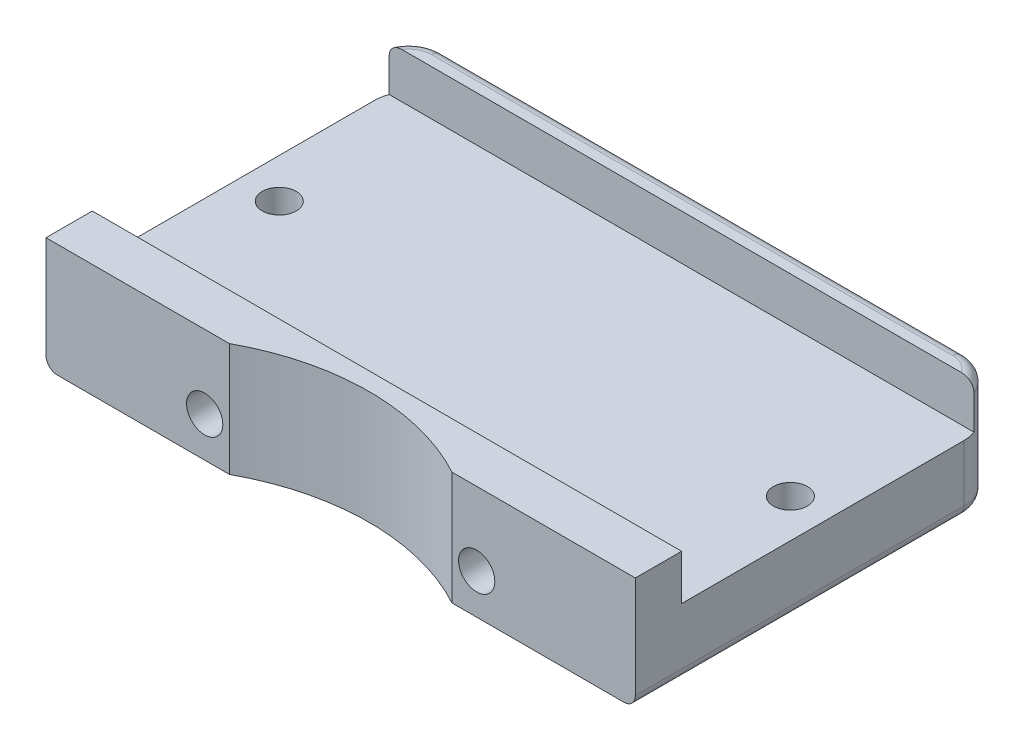
ISO-10303-21;
HEADER;
FILE_DESCRIPTION(('STEP AP214'),'2;1');
FILE_NAME('part.step','',(''),(''),'','','');
FILE_SCHEMA(('AUTOMOTIVE_DESIGN { 1 0 10303 214 1 1 1 1 }'));
ENDSEC;
DATA;
#1=APPLICATION_CONTEXT('core data for automotive mechanical design processes');
#2=APPLICATION_PROTOCOL_DEFINITION('international standard','automotive_design',2000,#1);
#3=PRODUCT_CONTEXT('',#1,'mechanical');
#4=PRODUCT('Part','Part','',(#3));
#5=PRODUCT_RELATED_PRODUCT_CATEGORY('part','',(#4));
#6=PRODUCT_DEFINITION_FORMATION('','',#4);
#7=PRODUCT_DEFINITION_CONTEXT('part definition',#1,'design');
#8=PRODUCT_DEFINITION('design','',#6,#7);
#9=PRODUCT_DEFINITION_SHAPE('','',#8);
#10=(LENGTH_UNIT() NAMED_UNIT(*) SI_UNIT(.MILLI.,.METRE.));
#11=(NAMED_UNIT(*) PLANE_ANGLE_UNIT() SI_UNIT($,.RADIAN.));
#12=(NAMED_UNIT(*) SI_UNIT($,.STERADIAN.) SOLID_ANGLE_UNIT());
#13=UNCERTAINTY_MEASURE_WITH_UNIT(LENGTH_MEASURE(1.E-05),#10,'distance_accuracy_value','');
#14=(GEOMETRIC_REPRESENTATION_CONTEXT(3) GLOBAL_UNCERTAINTY_ASSIGNED_CONTEXT((#13)) GLOBAL_UNIT_ASSIGNED_CONTEXT((#10,
#11,#12)) REPRESENTATION_CONTEXT('',''));
#15=CARTESIAN_POINT('',(0.,0.,0.));
#16=DIRECTION('',(0.,0.,1.));
#17=DIRECTION('',(1.,0.,0.));
#18=AXIS2_PLACEMENT_3D('',#15,#16,#17);
#19=CARTESIAN_POINT('',(0.,10.,33.9949326200461));
#20=DIRECTION('',(0.,1.,0.));
#21=DIRECTION('',(0.,0.,1.));
#22=AXIS2_PLACEMENT_3D('',#19,#20,#21);
#23=PLANE('',#22);
#24=DIRECTION('',(1.,0.,0.));
#25=VECTOR('',#24,1.);
#26=CARTESIAN_POINT('',(26.,10.,11.917981323224));
#27=LINE('',#26,#25);
#28=CARTESIAN_POINT('',(-26.,10.,11.917981323224));
#29=VERTEX_POINT('',#28);
#30=CARTESIAN_POINT('',(26.,10.,11.917981323224));
#31=VERTEX_POINT('',#30);
#32=EDGE_CURVE('E144',#29,#31,#27,.T.);
#33=ORIENTED_EDGE('',*,*,#32,.F.);
#34=DIRECTION('',(0.,0.,1.));
#35=VECTOR('',#34,1.);
#36=CARTESIAN_POINT('',(-26.,10.,16.));
#37=LINE('',#36,#35);
#38=CARTESIAN_POINT('',(-26.,10.,16.));
#39=VERTEX_POINT('',#38);
#40=EDGE_CURVE('E203',#29,#39,#37,.T.);
#41=ORIENTED_EDGE('',*,*,#40,.T.);
#42=DIRECTION('',(1.,0.,0.));
#43=VECTOR('',#42,1.);
#44=CARTESIAN_POINT('',(-26.,10.,16.));
#45=LINE('',#44,#43);
#46=CARTESIAN_POINT('',(-9.82,10.,16.));
#47=VERTEX_POINT('',#46);
#48=EDGE_CURVE('E206',#39,#47,#45,.T.);
#49=ORIENTED_EDGE('',*,*,#48,.T.);
#50=CARTESIAN_POINT('',(0.,10.,33.9949326200461));
#51=DIRECTION('',(0.,-1.,0.));
#52=DIRECTION('',(0.,0.,1.));
#53=AXIS2_PLACEMENT_3D('',#50,#51,#52);
#54=CIRCLE('',#53,20.5);
#55=CARTESIAN_POINT('',(9.82,10.,16.));
#56=VERTEX_POINT('',#55);
#57=EDGE_CURVE('E210',#47,#56,#54,.T.);
#58=ORIENTED_EDGE('',*,*,#57,.T.);
#59=DIRECTION('',(1.,0.,0.));
#60=VECTOR('',#59,1.);
#61=CARTESIAN_POINT('',(9.82,10.,16.));
#62=LINE('',#61,#60);
#63=CARTESIAN_POINT('',(26.,10.,16.));
#64=VERTEX_POINT('',#63);
#65=EDGE_CURVE('E213',#56,#64,#62,.T.);
#66=ORIENTED_EDGE('',*,*,#65,.T.);
#67=DIRECTION('',(0.,0.,-1.));
#68=VECTOR('',#67,1.);
#69=CARTESIAN_POINT('',(26.,10.,16.));
#70=LINE('',#69,#68);
#71=EDGE_CURVE('E216',#64,#31,#70,.T.);
#72=ORIENTED_EDGE('',*,*,#71,.T.);
#73=EDGE_LOOP('',(#33,#41,#49,#58,#66,#72));
#74=FACE_BOUND('',#73,.T.);
#75=ADVANCED_FACE('F16',(#74),#23,.T.);
#76=CARTESIAN_POINT('',(-26.,10.,16.));
#77=DIRECTION('',(1.,0.,0.));
#78=DIRECTION('',(0.,0.,-1.));
#79=AXIS2_PLACEMENT_3D('',#76,#77,#78);
#80=PLANE('',#79);
#81=DIRECTION('',(0.,-1.,0.));
#82=VECTOR('',#81,1.);
#83=CARTESIAN_POINT('',(-26.,10.,-13.));
#84=LINE('',#83,#82);
#85=CARTESIAN_POINT('',(-26.,6.,-13.));
#86=VERTEX_POINT('',#85);
#87=CARTESIAN_POINT('',(-26.,1.,-13.));
#88=VERTEX_POINT('',#87);
#89=EDGE_CURVE('E264',#86,#88,#84,.T.);
#90=ORIENTED_EDGE('',*,*,#89,.T.);
#91=DIRECTION('',(0.,0.,1.));
#92=VECTOR('',#91,1.);
#93=CARTESIAN_POINT('',(-26.,1.,16.));
#94=LINE('',#93,#92);
#95=CARTESIAN_POINT('',(-26.,1.,16.));
#96=VERTEX_POINT('',#95);
#97=EDGE_CURVE('E26',#88,#96,#94,.T.);
#98=ORIENTED_EDGE('',*,*,#97,.T.);
#99=DIRECTION('',(0.,-1.,0.));
#100=VECTOR('',#99,1.);
#101=CARTESIAN_POINT('',(-26.,10.,16.));
#102=LINE('',#101,#100);
#103=EDGE_CURVE('E238',#39,#96,#102,.T.);
#104=ORIENTED_EDGE('',*,*,#103,.F.);
#105=ORIENTED_EDGE('',*,*,#40,.F.);
#106=DIRECTION('',(0.,1.,0.));
#107=VECTOR('',#106,1.);
#108=CARTESIAN_POINT('',(-26.,6.,11.917981323224));
#109=LINE('',#108,#107);
#110=CARTESIAN_POINT('',(-26.,6.,11.917981323224));
#111=VERTEX_POINT('',#110);
#112=EDGE_CURVE('E150',#111,#29,#109,.T.);
#113=ORIENTED_EDGE('',*,*,#112,.F.);
#114=DIRECTION('',(0.,0.,1.));
#115=VECTOR('',#114,1.);
#116=CARTESIAN_POINT('',(-26.,6.,11.917981323224));
#117=LINE('',#116,#115);
#118=EDGE_CURVE('E151',#86,#111,#117,.T.);
#119=ORIENTED_EDGE('',*,*,#118,.F.);
#120=EDGE_LOOP('',(#90,#98,#104,#105,#113,#119));
#121=FACE_BOUND('',#120,.T.);
#122=ADVANCED_FACE('F346',(#121),#80,.F.);
#123=CARTESIAN_POINT('',(-26.,10.,16.));
#124=DIRECTION('',(0.,0.,-1.));
#125=DIRECTION('',(-1.,0.,0.));
#126=AXIS2_PLACEMENT_3D('',#123,#124,#125);
#127=PLANE('',#126);
#128=CARTESIAN_POINT('',(-12.,3.53,16.));
#129=DIRECTION('',(0.,0.,1.));
#130=DIRECTION('',(1.,0.,0.));
#131=AXIS2_PLACEMENT_3D('',#128,#129,#130);
#132=CIRCLE('',#131,1.6);
#133=CARTESIAN_POINT('',(-10.4,3.53,16.));
#134=VERTEX_POINT('',#133);
#135=EDGE_CURVE('E192',#134,#134,#132,.T.);
#136=ORIENTED_EDGE('',*,*,#135,.F.);
#137=EDGE_LOOP('',(#136));
#138=FACE_BOUND('',#137,.T.);
#139=ORIENTED_EDGE('',*,*,#103,.T.);
#140=CARTESIAN_POINT('',(-25.,1.,16.));
#141=DIRECTION('',(0.,0.,-1.));
#142=DIRECTION('',(-1.,0.,0.));
#143=AXIS2_PLACEMENT_3D('',#140,#141,#142);
#144=CIRCLE('',#143,1.);
#145=CARTESIAN_POINT('',(-25.,0.,16.));
#146=VERTEX_POINT('',#145);
#147=EDGE_CURVE('E10',#96,#146,#144,.F.);
#148=ORIENTED_EDGE('',*,*,#147,.T.);
#149=DIRECTION('',(1.,0.,0.));
#150=VECTOR('',#149,1.);
#151=CARTESIAN_POINT('',(-26.,0.,16.));
#152=LINE('',#151,#150);
#153=CARTESIAN_POINT('',(-9.82,0.,16.));
#154=VERTEX_POINT('',#153);
#155=EDGE_CURVE('E191',#146,#154,#152,.T.);
#156=ORIENTED_EDGE('',*,*,#155,.T.);
#157=DIRECTION('',(0.,-1.,0.));
#158=VECTOR('',#157,1.);
#159=CARTESIAN_POINT('',(-9.82,10.,16.));
#160=LINE('',#159,#158);
#161=EDGE_CURVE('E234',#47,#154,#160,.T.);
#162=ORIENTED_EDGE('',*,*,#161,.F.);
#163=ORIENTED_EDGE('',*,*,#48,.F.);
#164=EDGE_LOOP('',(#139,#148,#156,#162,#163));
#165=FACE_BOUND('',#164,.T.);
#166=ADVANCED_FACE('F342',(#138,#165),#127,.F.);
#167=CARTESIAN_POINT('',(0.,10.,33.9949326200461));
#168=DIRECTION('',(0.,-1.,0.));
#169=DIRECTION('',(0.,0.,-1.));
#170=AXIS2_PLACEMENT_3D('',#167,#168,#169);
#171=CYLINDRICAL_SURFACE('',#170,20.5);
#172=CARTESIAN_POINT('',(0.,0.,33.9949326200461));
#173=DIRECTION('',(0.,-1.,0.));
#174=DIRECTION('',(0.,0.,1.));
#175=AXIS2_PLACEMENT_3D('',#172,#173,#174);
#176=CIRCLE('',#175,20.5);
#177=CARTESIAN_POINT('',(9.82,0.,16.));
#178=VERTEX_POINT('',#177);
#179=EDGE_CURVE('E222',#154,#178,#176,.T.);
#180=ORIENTED_EDGE('',*,*,#179,.T.);
#181=DIRECTION('',(0.,-1.,0.));
#182=VECTOR('',#181,1.);
#183=CARTESIAN_POINT('',(9.82,10.,16.));
#184=LINE('',#183,#182);
#185=EDGE_CURVE('E230',#56,#178,#184,.T.);
#186=ORIENTED_EDGE('',*,*,#185,.F.);
#187=ORIENTED_EDGE('',*,*,#57,.F.);
#188=ORIENTED_EDGE('',*,*,#161,.T.);
#189=EDGE_LOOP('',(#180,#186,#187,#188));
#190=FACE_BOUND('',#189,.T.);
#191=ADVANCED_FACE('F338',(#190),#171,.F.);
#192=CARTESIAN_POINT('',(9.82,10.,16.));
#193=DIRECTION('',(0.,0.,-1.));
#194=DIRECTION('',(-1.,0.,0.));
#195=AXIS2_PLACEMENT_3D('',#192,#193,#194);
#196=PLANE('',#195);
#197=CARTESIAN_POINT('',(12.,3.53,16.));
#198=DIRECTION('',(0.,0.,1.));
#199=DIRECTION('',(1.,0.,0.));
#200=AXIS2_PLACEMENT_3D('',#197,#198,#199);
#201=CIRCLE('',#200,1.6);
#202=CARTESIAN_POINT('',(13.6,3.53,16.));
#203=VERTEX_POINT('',#202);
#204=EDGE_CURVE('E196',#203,#203,#201,.T.);
#205=ORIENTED_EDGE('',*,*,#204,.F.);
#206=EDGE_LOOP('',(#205));
#207=FACE_BOUND('',#206,.T.);
#208=DIRECTION('',(1.,0.,0.));
#209=VECTOR('',#208,1.);
#210=CARTESIAN_POINT('',(9.82,0.,16.));
#211=LINE('',#210,#209);
#212=CARTESIAN_POINT('',(25.,0.,16.));
#213=VERTEX_POINT('',#212);
#214=EDGE_CURVE('E207',#178,#213,#211,.T.);
#215=ORIENTED_EDGE('',*,*,#214,.T.);
#216=CARTESIAN_POINT('',(25.,1.,16.));
#217=DIRECTION('',(0.,0.,-1.));
#218=DIRECTION('',(-1.,0.,0.));
#219=AXIS2_PLACEMENT_3D('',#216,#217,#218);
#220=CIRCLE('',#219,1.);
#221=CARTESIAN_POINT('',(26.,1.,16.));
#222=VERTEX_POINT('',#221);
#223=EDGE_CURVE('E408',#213,#222,#220,.F.);
#224=ORIENTED_EDGE('',*,*,#223,.T.);
#225=DIRECTION('',(0.,-1.,0.));
#226=VECTOR('',#225,1.);
#227=CARTESIAN_POINT('',(26.,10.,16.));
#228=LINE('',#227,#226);
#229=EDGE_CURVE('E219',#64,#222,#228,.T.);
#230=ORIENTED_EDGE('',*,*,#229,.F.);
#231=ORIENTED_EDGE('',*,*,#65,.F.);
#232=ORIENTED_EDGE('',*,*,#185,.T.);
#233=EDGE_LOOP('',(#215,#224,#230,#231,#232));
#234=FACE_BOUND('',#233,.T.);
#235=ADVANCED_FACE('F335',(#207,#234),#196,.F.);
#236=CARTESIAN_POINT('',(26.,10.,16.));
#237=DIRECTION('',(-1.,0.,0.));
#238=DIRECTION('',(0.,0.,1.));
#239=AXIS2_PLACEMENT_3D('',#236,#237,#238);
#240=PLANE('',#239);
#241=ORIENTED_EDGE('',*,*,#229,.T.);
#242=DIRECTION('',(0.,0.,-1.));
#243=VECTOR('',#242,1.);
#244=CARTESIAN_POINT('',(26.,1.,16.));
#245=LINE('',#244,#243);
#246=CARTESIAN_POINT('',(26.,1.,-13.));
#247=VERTEX_POINT('',#246);
#248=EDGE_CURVE('E391',#222,#247,#245,.T.);
#249=ORIENTED_EDGE('',*,*,#248,.T.);
#250=DIRECTION('',(0.,-1.,0.));
#251=VECTOR('',#250,1.);
#252=CARTESIAN_POINT('',(26.,10.,-13.));
#253=LINE('',#252,#251);
#254=CARTESIAN_POINT('',(26.,6.,-13.));
#255=VERTEX_POINT('',#254);
#256=EDGE_CURVE('E166',#247,#255,#253,.F.);
#257=ORIENTED_EDGE('',*,*,#256,.T.);
#258=DIRECTION('',(0.,0.,-1.));
#259=VECTOR('',#258,1.);
#260=CARTESIAN_POINT('',(26.,6.,-14.082018676776));
#261=LINE('',#260,#259);
#262=CARTESIAN_POINT('',(26.,6.,11.917981323224));
#263=VERTEX_POINT('',#262);
#264=EDGE_CURVE('E156',#263,#255,#261,.T.);
#265=ORIENTED_EDGE('',*,*,#264,.F.);
#266=DIRECTION('',(0.,1.,0.));
#267=VECTOR('',#266,1.);
#268=CARTESIAN_POINT('',(26.,6.,11.917981323224));
#269=LINE('',#268,#267);
#270=EDGE_CURVE('E138',#263,#31,#269,.T.);
#271=ORIENTED_EDGE('',*,*,#270,.T.);
#272=ORIENTED_EDGE('',*,*,#71,.F.);
#273=EDGE_LOOP('',(#241,#249,#257,#265,#271,#272));
#274=FACE_BOUND('',#273,.T.);
#275=ADVANCED_FACE('F163',(#274),#240,.F.);
#276=CARTESIAN_POINT('',(26.,10.,-16.));
#277=DIRECTION('',(0.,0.,1.));
#278=DIRECTION('',(1.,0.,0.));
#279=AXIS2_PLACEMENT_3D('',#276,#277,#278);
#280=PLANE('',#279);
#281=CARTESIAN_POINT('',(-12.,3.53,-16.));
#282=DIRECTION('',(0.,0.,1.));
#283=DIRECTION('',(1.,0.,0.));
#284=AXIS2_PLACEMENT_3D('',#281,#282,#283);
#285=CIRCLE('',#284,1.6);
#286=CARTESIAN_POINT('',(-10.4,3.53,-16.));
#287=VERTEX_POINT('',#286);
#288=EDGE_CURVE('E187',#287,#287,#285,.T.);
#289=ORIENTED_EDGE('',*,*,#288,.T.);
#290=EDGE_LOOP('',(#289));
#291=FACE_BOUND('',#290,.T.);
#292=CARTESIAN_POINT('',(12.,3.53,-16.));
#293=DIRECTION('',(0.,0.,1.));
#294=DIRECTION('',(1.,0.,0.));
#295=AXIS2_PLACEMENT_3D('',#292,#293,#294);
#296=CIRCLE('',#295,1.6);
#297=CARTESIAN_POINT('',(13.6,3.53,-16.));
#298=VERTEX_POINT('',#297);
#299=EDGE_CURVE('E185',#298,#298,#296,.T.);
#300=ORIENTED_EDGE('',*,*,#299,.T.);
#301=EDGE_LOOP('',(#300));
#302=FACE_BOUND('',#301,.T.);
#303=DIRECTION('',(0.,-1.,0.));
#304=VECTOR('',#303,1.);
#305=CARTESIAN_POINT('',(23.,10.,-16.));
#306=LINE('',#305,#304);
#307=CARTESIAN_POINT('',(23.,9.,-16.));
#308=VERTEX_POINT('',#307);
#309=CARTESIAN_POINT('',(23.,1.,-16.));
#310=VERTEX_POINT('',#309);
#311=EDGE_CURVE('E245',#308,#310,#306,.T.);
#312=ORIENTED_EDGE('',*,*,#311,.T.);
#313=DIRECTION('',(-1.,0.,0.));
#314=VECTOR('',#313,1.);
#315=CARTESIAN_POINT('',(26.,1.,-16.));
#316=LINE('',#315,#314);
#317=CARTESIAN_POINT('',(-23.,1.,-16.));
#318=VERTEX_POINT('',#317);
#319=EDGE_CURVE('E414',#310,#318,#316,.T.);
#320=ORIENTED_EDGE('',*,*,#319,.T.);
#321=DIRECTION('',(0.,-1.,0.));
#322=VECTOR('',#321,1.);
#323=CARTESIAN_POINT('',(-23.,10.,-16.));
#324=LINE('',#323,#322);
#325=CARTESIAN_POINT('',(-23.,9.,-16.));
#326=VERTEX_POINT('',#325);
#327=EDGE_CURVE('E241',#318,#326,#324,.F.);
#328=ORIENTED_EDGE('',*,*,#327,.T.);
#329=DIRECTION('',(-1.,0.,0.));
#330=VECTOR('',#329,1.);
#331=CARTESIAN_POINT('',(23.,9.,-16.));
#332=LINE('',#331,#330);
#333=EDGE_CURVE('E411',#326,#308,#332,.F.);
#334=ORIENTED_EDGE('',*,*,#333,.T.);
#335=EDGE_LOOP('',(#312,#320,#328,#334));
#336=FACE_BOUND('',#335,.T.);
#337=ADVANCED_FACE('F325',(#291,#302,#336),#280,.F.);
#338=DIRECTION('',(-1.,0.,0.));
#339=VECTOR('',#338,1.);
#340=CARTESIAN_POINT('',(-26.,10.,-14.082018676776));
#341=LINE('',#340,#339);
#342=CARTESIAN_POINT('',(24.6820331694435,10.,-14.082018676776));
#343=VERTEX_POINT('',#342);
#344=CARTESIAN_POINT('',(-24.6820331694435,10.,-14.082018676776));
#345=VERTEX_POINT('',#344);
#346=EDGE_CURVE('E160',#343,#345,#341,.T.);
#347=ORIENTED_EDGE('',*,*,#346,.F.);
#348=CARTESIAN_POINT('',(23.,10.,-13.));
#349=DIRECTION('',(0.,1.,0.));
#350=DIRECTION('',(0.,0.,1.));
#351=AXIS2_PLACEMENT_3D('',#348,#349,#350);
#352=CIRCLE('',#351,2.);
#353=CARTESIAN_POINT('',(23.,10.,-15.));
#354=VERTEX_POINT('',#353);
#355=EDGE_CURVE('E273',#343,#354,#352,.T.);
#356=ORIENTED_EDGE('',*,*,#355,.T.);
#357=DIRECTION('',(-1.,0.,0.));
#358=VECTOR('',#357,1.);
#359=CARTESIAN_POINT('',(-23.,10.,-15.));
#360=LINE('',#359,#358);
#361=CARTESIAN_POINT('',(-23.,10.,-15.));
#362=VERTEX_POINT('',#361);
#363=EDGE_CURVE('E267',#354,#362,#360,.T.);
#364=ORIENTED_EDGE('',*,*,#363,.T.);
#365=CARTESIAN_POINT('',(-23.,10.,-13.));
#366=DIRECTION('',(0.,1.,0.));
#367=DIRECTION('',(0.,0.,1.));
#368=AXIS2_PLACEMENT_3D('',#365,#366,#367);
#369=CIRCLE('',#368,2.);
#370=EDGE_CURVE('E270',#362,#345,#369,.T.);
#371=ORIENTED_EDGE('',*,*,#370,.T.);
#372=EDGE_LOOP('',(#347,#356,#364,#371));
#373=FACE_BOUND('',#372,.T.);
#374=ADVANCED_FACE('F322',(#373),#23,.T.);
#375=CARTESIAN_POINT('',(0.,0.,33.9949326200461));
#376=DIRECTION('',(0.,1.,0.));
#377=DIRECTION('',(0.,0.,1.));
#378=AXIS2_PLACEMENT_3D('',#375,#376,#377);
#379=PLANE('',#378);
#380=CARTESIAN_POINT('',(-22.5,0.,-1.08201867677598));
#381=DIRECTION('',(0.,1.,0.));
#382=DIRECTION('',(0.,0.,1.));
#383=AXIS2_PLACEMENT_3D('',#380,#381,#382);
#384=CIRCLE('',#383,1.5);
#385=CARTESIAN_POINT('',(-22.5,0.,0.417981323224016));
#386=VERTEX_POINT('',#385);
#387=EDGE_CURVE('E180',#386,#386,#384,.T.);
#388=ORIENTED_EDGE('',*,*,#387,.T.);
#389=EDGE_LOOP('',(#388));
#390=FACE_BOUND('',#389,.T.);
#391=CARTESIAN_POINT('',(22.6,0.,-1.08201867677598));
#392=DIRECTION('',(0.,1.,0.));
#393=DIRECTION('',(0.,0.,1.));
#394=AXIS2_PLACEMENT_3D('',#391,#392,#393);
#395=CIRCLE('',#394,1.5);
#396=CARTESIAN_POINT('',(22.6,0.,0.417981323224022));
#397=VERTEX_POINT('',#396);
#398=EDGE_CURVE('E425',#397,#397,#395,.T.);
#399=ORIENTED_EDGE('',*,*,#398,.T.);
#400=EDGE_LOOP('',(#399));
#401=FACE_BOUND('',#400,.T.);
#402=CARTESIAN_POINT('',(23.,0.,-13.));
#403=DIRECTION('',(0.,1.,0.));
#404=DIRECTION('',(0.,0.,1.));
#405=AXIS2_PLACEMENT_3D('',#402,#403,#404);
#406=CIRCLE('',#405,2.);
#407=CARTESIAN_POINT('',(23.,0.,-15.));
#408=VERTEX_POINT('',#407);
#409=CARTESIAN_POINT('',(25.,0.,-13.));
#410=VERTEX_POINT('',#409);
#411=EDGE_CURVE('E41',#408,#410,#406,.F.);
#412=ORIENTED_EDGE('',*,*,#411,.T.);
#413=DIRECTION('',(0.,0.,-1.));
#414=VECTOR('',#413,1.);
#415=CARTESIAN_POINT('',(25.,0.,33.9949326200461));
#416=LINE('',#415,#414);
#417=EDGE_CURVE('E405',#410,#213,#416,.F.);
#418=ORIENTED_EDGE('',*,*,#417,.T.);
#419=ORIENTED_EDGE('',*,*,#214,.F.);
#420=ORIENTED_EDGE('',*,*,#179,.F.);
#421=ORIENTED_EDGE('',*,*,#155,.F.);
#422=DIRECTION('',(0.,0.,1.));
#423=VECTOR('',#422,1.);
#424=CARTESIAN_POINT('',(-25.,0.,33.9949326200461));
#425=LINE('',#424,#423);
#426=CARTESIAN_POINT('',(-25.,0.,-13.));
#427=VERTEX_POINT('',#426);
#428=EDGE_CURVE('E387',#146,#427,#425,.F.);
#429=ORIENTED_EDGE('',*,*,#428,.T.);
#430=CARTESIAN_POINT('',(-23.,0.,-13.));
#431=DIRECTION('',(0.,1.,0.));
#432=DIRECTION('',(0.,0.,1.));
#433=AXIS2_PLACEMENT_3D('',#430,#431,#432);
#434=CIRCLE('',#433,2.);
#435=CARTESIAN_POINT('',(-23.,0.,-15.));
#436=VERTEX_POINT('',#435);
#437=EDGE_CURVE('E390',#427,#436,#434,.F.);
#438=ORIENTED_EDGE('',*,*,#437,.T.);
#439=DIRECTION('',(-1.,0.,0.));
#440=VECTOR('',#439,1.);
#441=CARTESIAN_POINT('',(0.,0.,-15.));
#442=LINE('',#441,#440);
#443=EDGE_CURVE('E395',#436,#408,#442,.F.);
#444=ORIENTED_EDGE('',*,*,#443,.T.);
#445=EDGE_LOOP('',(#412,#418,#419,#420,#421,#429,#438,#444));
#446=FACE_BOUND('',#445,.T.);
#447=ADVANCED_FACE('F320',(#390,#401,#446),#379,.F.);
#448=CARTESIAN_POINT('',(12.,3.53,-16.));
#449=DIRECTION('',(0.,0.,1.));
#450=DIRECTION('',(1.,0.,0.));
#451=AXIS2_PLACEMENT_3D('',#448,#449,#450);
#452=CYLINDRICAL_SURFACE('',#451,1.6);
#453=ORIENTED_EDGE('',*,*,#299,.F.);
#454=EDGE_LOOP('',(#453));
#455=FACE_BOUND('',#454,.T.);
#456=ORIENTED_EDGE('',*,*,#204,.T.);
#457=EDGE_LOOP('',(#456));
#458=FACE_BOUND('',#457,.T.);
#459=ADVANCED_FACE('F316',(#455,#458),#452,.F.);
#460=CARTESIAN_POINT('',(-12.,3.53,-16.));
#461=DIRECTION('',(0.,0.,1.));
#462=DIRECTION('',(1.,0.,0.));
#463=AXIS2_PLACEMENT_3D('',#460,#461,#462);
#464=CYLINDRICAL_SURFACE('',#463,1.6);
#465=ORIENTED_EDGE('',*,*,#288,.F.);
#466=EDGE_LOOP('',(#465));
#467=FACE_BOUND('',#466,.T.);
#468=ORIENTED_EDGE('',*,*,#135,.T.);
#469=EDGE_LOOP('',(#468));
#470=FACE_BOUND('',#469,.T.);
#471=ADVANCED_FACE('F313',(#467,#470),#464,.F.);
#472=CARTESIAN_POINT('',(26.,6.,11.917981323224));
#473=DIRECTION('',(0.,0.,1.));
#474=DIRECTION('',(1.,0.,0.));
#475=AXIS2_PLACEMENT_3D('',#472,#473,#474);
#476=PLANE('',#475);
#477=ORIENTED_EDGE('',*,*,#32,.T.);
#478=ORIENTED_EDGE('',*,*,#270,.F.);
#479=DIRECTION('',(1.,0.,0.));
#480=VECTOR('',#479,1.);
#481=CARTESIAN_POINT('',(26.,6.,11.917981323224));
#482=LINE('',#481,#480);
#483=EDGE_CURVE('E141',#111,#263,#482,.T.);
#484=ORIENTED_EDGE('',*,*,#483,.F.);
#485=ORIENTED_EDGE('',*,*,#112,.T.);
#486=EDGE_LOOP('',(#477,#478,#484,#485));
#487=FACE_BOUND('',#486,.T.);
#488=ADVANCED_FACE('F140',(#487),#476,.F.);
#489=CARTESIAN_POINT('',(-26.,6.,-14.082018676776));
#490=DIRECTION('',(0.,0.,-1.));
#491=DIRECTION('',(-1.,0.,0.));
#492=AXIS2_PLACEMENT_3D('',#489,#490,#491);
#493=PLANE('',#492);
#494=DIRECTION('',(0.,-1.,0.));
#495=VECTOR('',#494,1.);
#496=CARTESIAN_POINT('',(25.7980771224375,6.,-14.082018676776));
#497=LINE('',#496,#495);
#498=CARTESIAN_POINT('',(25.7980771224375,6.,-14.082018676776));
#499=VERTEX_POINT('',#498);
#500=CARTESIAN_POINT('',(25.7980771224375,9.,-14.082018676776));
#501=VERTEX_POINT('',#500);
#502=EDGE_CURVE('E260',#499,#501,#497,.F.);
#503=ORIENTED_EDGE('',*,*,#502,.T.);
#504=CARTESIAN_POINT('',(25.7980771224375,9.,-14.082018676776));
#505=CARTESIAN_POINT('',(25.7980775789538,9.02662050992044,-14.082018676776));
#506=CARTESIAN_POINT('',(25.7969366590518,9.05322791450221,-14.082018676776));
#507=CARTESIAN_POINT('',(25.7923894801311,9.10624469438087,-14.082018676776));
#508=CARTESIAN_POINT('',(25.7889835410388,9.1326540971122,-14.082018676776));
#509=CARTESIAN_POINT('',(25.7754217915997,9.21117700488716,-14.082018676776));
#510=CARTESIAN_POINT('',(25.7619217960767,9.2627516246537,-14.082018676776));
#511=CARTESIAN_POINT('',(25.7264805128414,9.36287701681895,-14.082018676776));
#512=CARTESIAN_POINT('',(25.7045390225519,9.41142771661783,-14.082018676776));
#513=CARTESIAN_POINT('',(25.6529712583157,9.5042707332466,-14.082018676776));
#514=CARTESIAN_POINT('',(25.6233429872744,9.54856193931676,-14.082018676776));
#515=CARTESIAN_POINT('',(25.5566939887939,9.63268202967923,-14.082018676776));
#516=CARTESIAN_POINT('',(25.5195323367533,9.67239895612008,-14.082018676776));
#517=CARTESIAN_POINT('',(25.4394209069369,9.74544814203056,-14.082018676776));
#518=CARTESIAN_POINT('',(25.396471575787,9.77878089367647,-14.082018676776));
#519=CARTESIAN_POINT('',(25.3032780734421,9.84036595827746,-14.082018676776));
#520=CARTESIAN_POINT('',(25.2527491601728,9.86818623182078,-14.082018676776));
#521=CARTESIAN_POINT('',(25.1479946141518,9.91582962946254,-14.082018676776));
#522=CARTESIAN_POINT('',(25.093763840263,9.93564135587183,-14.082018676776));
#523=CARTESIAN_POINT('',(24.9804858689304,9.9680036757783,-14.082018676776));
#524=CARTESIAN_POINT('',(24.9213319388318,9.98017500825578,-14.082018676776));
#525=CARTESIAN_POINT('',(24.8020941256108,9.99618154766828,-14.082018676776));
#526=CARTESIAN_POINT('',(24.7420140095364,10.0000444683831,-14.082018676776));
#527=CARTESIAN_POINT('',(24.6820331694435,10.,-14.082018676776));
#528=B_SPLINE_CURVE_WITH_KNOTS('',3,(#504,#505,#506,#507,#508,#509,#510,#511,#512,#513,#514,
#515,#516,#517,#518,#519,#520,#521,#522,#523,#524,#525,#526,#527),.UNSPECIFIED.,.F.,.F.,(4,2,2,
2,2,2,2,2,2,2,2,4),(0.,0.0798112373715453,0.159611204061499,0.318718405840809,0.477829426077221,
0.636981826253249,0.799444076616816,0.961893797204243,1.13421920787431,1.30678901422152,
1.4873601915206,1.66732811017297),.UNSPECIFIED.);
#529=EDGE_CURVE('E292',#501,#343,#528,.T.);
#530=ORIENTED_EDGE('',*,*,#529,.T.);
#531=ORIENTED_EDGE('',*,*,#346,.T.);
#532=CARTESIAN_POINT('',(-24.6820331694435,10.,-14.082018676776));
#533=CARTESIAN_POINT('',(-24.7171965263616,9.99999973990541,-14.082018676776));
#534=CARTESIAN_POINT('',(-24.7523522404122,9.99868669440651,-14.082018676776));
#535=CARTESIAN_POINT('',(-24.822479498063,9.99330372934799,-14.082018676776));
#536=CARTESIAN_POINT('',(-24.8574508640928,9.98923151691998,-14.082018676776));
#537=CARTESIAN_POINT('',(-24.96210227987,9.9726255309732,-14.082018676776));
#538=CARTESIAN_POINT('',(-25.0311555313657,9.95569959058025,-14.082018676776));
#539=CARTESIAN_POINT('',(-25.1654469025281,9.90954495664222,-14.082018676776));
#540=CARTESIAN_POINT('',(-25.2306636613789,9.88025367070426,-14.082018676776));
#541=CARTESIAN_POINT('',(-25.3540308165175,9.80960151561055,-14.082018676776));
#542=CARTESIAN_POINT('',(-25.4122021310811,9.76827768074824,-14.082018676776));
#543=CARTESIAN_POINT('',(-25.5119110677422,9.68064685960548,-14.082018676776));
#544=CARTESIAN_POINT('',(-25.5546271922194,9.63567806934482,-14.082018676776));
#545=CARTESIAN_POINT('',(-25.6309730688948,9.53851914192017,-14.082018676776));
#546=CARTESIAN_POINT('',(-25.6646002833503,9.48632699403817,-14.082018676776));
#547=CARTESIAN_POINT('',(-25.7185346792879,9.3816883300483,-14.082018676776));
#548=CARTESIAN_POINT('',(-25.7398013217924,9.3297334209133,-14.082018676776));
#549=CARTESIAN_POINT('',(-25.772775434205,9.22293008225713,-14.082018676776));
#550=CARTESIAN_POINT('',(-25.7845021286211,9.16808771021918,-14.082018676776));
#551=CARTESIAN_POINT('',(-25.7935213689506,9.09400504011828,-14.082018676776));
#552=CARTESIAN_POINT('',(-25.7952301980306,9.07522948153654,-14.082018676776));
#553=CARTESIAN_POINT('',(-25.7975065389816,9.03763890782326,-14.082018676776));
#554=CARTESIAN_POINT('',(-25.7980758413839,9.01882400116759,-14.082018676776));
#555=CARTESIAN_POINT('',(-25.7980771224375,9.,-14.082018676776));
#556=B_SPLINE_CURVE_WITH_KNOTS('',3,(#532,#533,#534,#535,#536,#537,#538,#539,#540,#541,#542,
#543,#544,#545,#546,#547,#548,#549,#550,#551,#552,#553,#554,#555),.UNSPECIFIED.,.F.,.F.,(4,2,2,
2,2,2,2,2,2,2,2,4),(0.,0.105444155222729,0.210976042206026,0.423119441929132,0.636349820403544,
0.848930723953284,1.03398420475073,1.21908930165112,1.38667490855329,1.55392196146671,
1.6104561113152,1.66690135944503),.UNSPECIFIED.);
#557=CARTESIAN_POINT('',(-25.7980771224375,9.,-14.082018676776));
#558=VERTEX_POINT('',#557);
#559=EDGE_CURVE('E283',#345,#558,#556,.T.);
#560=ORIENTED_EDGE('',*,*,#559,.T.);
#561=DIRECTION('',(0.,-1.,0.));
#562=VECTOR('',#561,1.);
#563=CARTESIAN_POINT('',(-25.7980771224375,10.,-14.082018676776));
#564=LINE('',#563,#562);
#565=CARTESIAN_POINT('',(-25.7980771224375,6.,-14.082018676776));
#566=VERTEX_POINT('',#565);
#567=EDGE_CURVE('E257',#558,#566,#564,.T.);
#568=ORIENTED_EDGE('',*,*,#567,.T.);
#569=DIRECTION('',(-1.,0.,0.));
#570=VECTOR('',#569,1.);
#571=CARTESIAN_POINT('',(-26.,6.,-14.082018676776));
#572=LINE('',#571,#570);
#573=EDGE_CURVE('E168',#499,#566,#572,.T.);
#574=ORIENTED_EDGE('',*,*,#573,.F.);
#575=EDGE_LOOP('',(#503,#530,#531,#560,#568,#574));
#576=FACE_BOUND('',#575,.T.);
#577=ADVANCED_FACE('F303',(#576),#493,.F.);
#578=CARTESIAN_POINT('',(0.,6.,0.));
#579=DIRECTION('',(0.,-1.,0.));
#580=DIRECTION('',(0.,0.,-1.));
#581=AXIS2_PLACEMENT_3D('',#578,#579,#580);
#582=PLANE('',#581);
#583=CARTESIAN_POINT('',(-22.5,6.,-1.08201867677598));
#584=DIRECTION('',(0.,1.,0.));
#585=DIRECTION('',(0.,0.,1.));
#586=AXIS2_PLACEMENT_3D('',#583,#584,#585);
#587=CIRCLE('',#586,1.5);
#588=CARTESIAN_POINT('',(-22.5,6.,0.417981323224016));
#589=VERTEX_POINT('',#588);
#590=EDGE_CURVE('E662',#589,#589,#587,.T.);
#591=ORIENTED_EDGE('',*,*,#590,.F.);
#592=EDGE_LOOP('',(#591));
#593=FACE_BOUND('',#592,.T.);
#594=CARTESIAN_POINT('',(22.6,6.,-1.08201867677598));
#595=DIRECTION('',(0.,1.,0.));
#596=DIRECTION('',(0.,0.,1.));
#597=AXIS2_PLACEMENT_3D('',#594,#595,#596);
#598=CIRCLE('',#597,1.5);
#599=CARTESIAN_POINT('',(22.6,6.,0.417981323224022));
#600=VERTEX_POINT('',#599);
#601=EDGE_CURVE('E664',#600,#600,#598,.T.);
#602=ORIENTED_EDGE('',*,*,#601,.F.);
#603=EDGE_LOOP('',(#602));
#604=FACE_BOUND('',#603,.T.);
#605=ORIENTED_EDGE('',*,*,#264,.T.);
#606=CARTESIAN_POINT('',(23.,6.,-13.));
#607=DIRECTION('',(0.,-1.,0.));
#608=DIRECTION('',(0.,0.,-1.));
#609=AXIS2_PLACEMENT_3D('',#606,#607,#608);
#610=CIRCLE('',#609,3.);
#611=EDGE_CURVE('E254',#255,#499,#610,.F.);
#612=ORIENTED_EDGE('',*,*,#611,.T.);
#613=ORIENTED_EDGE('',*,*,#573,.T.);
#614=CARTESIAN_POINT('',(-23.,6.,-13.));
#615=DIRECTION('',(0.,-1.,0.));
#616=DIRECTION('',(0.,0.,-1.));
#617=AXIS2_PLACEMENT_3D('',#614,#615,#616);
#618=CIRCLE('',#617,3.);
#619=EDGE_CURVE('E251',#566,#86,#618,.F.);
#620=ORIENTED_EDGE('',*,*,#619,.T.);
#621=ORIENTED_EDGE('',*,*,#118,.T.);
#622=ORIENTED_EDGE('',*,*,#483,.T.);
#623=EDGE_LOOP('',(#605,#612,#613,#620,#621,#622));
#624=FACE_BOUND('',#623,.T.);
#625=ADVANCED_FACE('F155',(#593,#604,#624),#582,.F.);
#626=CARTESIAN_POINT('',(22.6,0.,-1.08201867677598));
#627=DIRECTION('',(0.,1.,0.));
#628=DIRECTION('',(0.,0.,1.));
#629=AXIS2_PLACEMENT_3D('',#626,#627,#628);
#630=CYLINDRICAL_SURFACE('',#629,1.5);
#631=ORIENTED_EDGE('',*,*,#398,.F.);
#632=EDGE_LOOP('',(#631));
#633=FACE_BOUND('',#632,.T.);
#634=ORIENTED_EDGE('',*,*,#601,.T.);
#635=EDGE_LOOP('',(#634));
#636=FACE_BOUND('',#635,.T.);
#637=ADVANCED_FACE('F604',(#633,#636),#630,.F.);
#638=CARTESIAN_POINT('',(-22.5,0.,-1.08201867677598));
#639=DIRECTION('',(0.,1.,0.));
#640=DIRECTION('',(0.,0.,1.));
#641=AXIS2_PLACEMENT_3D('',#638,#639,#640);
#642=CYLINDRICAL_SURFACE('',#641,1.5);
#643=ORIENTED_EDGE('',*,*,#387,.F.);
#644=EDGE_LOOP('',(#643));
#645=FACE_BOUND('',#644,.T.);
#646=ORIENTED_EDGE('',*,*,#590,.T.);
#647=EDGE_LOOP('',(#646));
#648=FACE_BOUND('',#647,.T.);
#649=ADVANCED_FACE('F354',(#645,#648),#642,.F.);
#650=CARTESIAN_POINT('',(23.,10.,-13.));
#651=DIRECTION('',(0.,-1.,0.));
#652=DIRECTION('',(0.,0.,-1.));
#653=AXIS2_PLACEMENT_3D('',#650,#651,#652);
#654=CYLINDRICAL_SURFACE('',#653,3.);
#655=ORIENTED_EDGE('',*,*,#311,.F.);
#656=CARTESIAN_POINT('',(23.,9.,-13.));
#657=DIRECTION('',(0.,1.,0.));
#658=DIRECTION('',(0.,0.,1.));
#659=AXIS2_PLACEMENT_3D('',#656,#657,#658);
#660=CIRCLE('',#659,3.);
#661=EDGE_CURVE('E280',#308,#501,#660,.F.);
#662=ORIENTED_EDGE('',*,*,#661,.T.);
#663=ORIENTED_EDGE('',*,*,#502,.F.);
#664=ORIENTED_EDGE('',*,*,#611,.F.);
#665=ORIENTED_EDGE('',*,*,#256,.F.);
#666=CARTESIAN_POINT('',(23.,1.,-13.));
#667=DIRECTION('',(0.,1.,0.));
#668=DIRECTION('',(0.,0.,1.));
#669=AXIS2_PLACEMENT_3D('',#666,#667,#668);
#670=CIRCLE('',#669,3.);
#671=EDGE_CURVE('E277',#247,#310,#670,.T.);
#672=ORIENTED_EDGE('',*,*,#671,.T.);
#673=EDGE_LOOP('',(#655,#662,#663,#664,#665,#672));
#674=FACE_BOUND('',#673,.T.);
#675=ADVANCED_FACE('F350',(#674),#654,.T.);
#676=CARTESIAN_POINT('',(-23.,10.,-13.));
#677=DIRECTION('',(0.,-1.,0.));
#678=DIRECTION('',(0.,0.,-1.));
#679=AXIS2_PLACEMENT_3D('',#676,#677,#678);
#680=CYLINDRICAL_SURFACE('',#679,3.);
#681=ORIENTED_EDGE('',*,*,#567,.F.);
#682=CARTESIAN_POINT('',(-23.,9.,-13.));
#683=DIRECTION('',(0.,1.,0.));
#684=DIRECTION('',(0.,0.,1.));
#685=AXIS2_PLACEMENT_3D('',#682,#683,#684);
#686=CIRCLE('',#685,3.);
#687=EDGE_CURVE('E397',#558,#326,#686,.F.);
#688=ORIENTED_EDGE('',*,*,#687,.T.);
#689=ORIENTED_EDGE('',*,*,#327,.F.);
#690=CARTESIAN_POINT('',(-23.,1.,-13.));
#691=DIRECTION('',(0.,1.,0.));
#692=DIRECTION('',(0.,0.,1.));
#693=AXIS2_PLACEMENT_3D('',#690,#691,#692);
#694=CIRCLE('',#693,3.);
#695=EDGE_CURVE('E443',#318,#88,#694,.T.);
#696=ORIENTED_EDGE('',*,*,#695,.T.);
#697=ORIENTED_EDGE('',*,*,#89,.F.);
#698=ORIENTED_EDGE('',*,*,#619,.F.);
#699=EDGE_LOOP('',(#681,#688,#689,#696,#697,#698));
#700=FACE_BOUND('',#699,.T.);
#701=ADVANCED_FACE('F353',(#700),#680,.T.);
#702=CARTESIAN_POINT('',(-23.,9.,-13.));
#703=DIRECTION('',(0.,1.,0.));
#704=DIRECTION('',(0.,0.,1.));
#705=AXIS2_PLACEMENT_3D('',#702,#703,#704);
#706=TOROIDAL_SURFACE('',#705,2.,1.);
#707=ORIENTED_EDGE('',*,*,#559,.F.);
#708=ORIENTED_EDGE('',*,*,#370,.F.);
#709=CARTESIAN_POINT('',(-23.,9.,-15.));
#710=DIRECTION('',(1.,0.,0.));
#711=DIRECTION('',(0.,0.,-1.));
#712=AXIS2_PLACEMENT_3D('',#709,#710,#711);
#713=CIRCLE('',#712,1.);
#714=EDGE_CURVE('E422',#326,#362,#713,.T.);
#715=ORIENTED_EDGE('',*,*,#714,.F.);
#716=ORIENTED_EDGE('',*,*,#687,.F.);
#717=EDGE_LOOP('',(#707,#708,#715,#716));
#718=FACE_BOUND('',#717,.T.);
#719=ADVANCED_FACE('F299',(#718),#706,.T.);
#720=CARTESIAN_POINT('',(0.,9.,-15.));
#721=DIRECTION('',(1.,0.,0.));
#722=DIRECTION('',(0.,0.,-1.));
#723=AXIS2_PLACEMENT_3D('',#720,#721,#722);
#724=CYLINDRICAL_SURFACE('',#723,1.);
#725=ORIENTED_EDGE('',*,*,#714,.T.);
#726=ORIENTED_EDGE('',*,*,#363,.F.);
#727=CARTESIAN_POINT('',(23.,9.,-15.));
#728=DIRECTION('',(1.,0.,0.));
#729=DIRECTION('',(0.,0.,-1.));
#730=AXIS2_PLACEMENT_3D('',#727,#728,#729);
#731=CIRCLE('',#730,1.);
#732=EDGE_CURVE('E419',#308,#354,#731,.T.);
#733=ORIENTED_EDGE('',*,*,#732,.F.);
#734=ORIENTED_EDGE('',*,*,#333,.F.);
#735=EDGE_LOOP('',(#725,#726,#733,#734));
#736=FACE_BOUND('',#735,.T.);
#737=ADVANCED_FACE('F361',(#736),#724,.T.);
#738=CARTESIAN_POINT('',(23.,9.,-13.));
#739=DIRECTION('',(0.,1.,0.));
#740=DIRECTION('',(0.,0.,1.));
#741=AXIS2_PLACEMENT_3D('',#738,#739,#740);
#742=TOROIDAL_SURFACE('',#741,2.,1.);
#743=ORIENTED_EDGE('',*,*,#529,.F.);
#744=ORIENTED_EDGE('',*,*,#661,.F.);
#745=ORIENTED_EDGE('',*,*,#732,.T.);
#746=ORIENTED_EDGE('',*,*,#355,.F.);
#747=EDGE_LOOP('',(#743,#744,#745,#746));
#748=FACE_BOUND('',#747,.T.);
#749=ADVANCED_FACE('F358',(#748),#742,.T.);
#750=CARTESIAN_POINT('',(-25.,1.,16.));
#751=DIRECTION('',(0.,0.,1.));
#752=DIRECTION('',(1.,0.,0.));
#753=AXIS2_PLACEMENT_3D('',#750,#751,#752);
#754=CYLINDRICAL_SURFACE('',#753,1.);
#755=ORIENTED_EDGE('',*,*,#147,.F.);
#756=ORIENTED_EDGE('',*,*,#97,.F.);
#757=CARTESIAN_POINT('',(-25.,1.,-13.));
#758=DIRECTION('',(0.,0.,-1.));
#759=DIRECTION('',(-1.,0.,0.));
#760=AXIS2_PLACEMENT_3D('',#757,#758,#759);
#761=CIRCLE('',#760,1.);
#762=EDGE_CURVE('E20',#427,#88,#761,.T.);
#763=ORIENTED_EDGE('',*,*,#762,.F.);
#764=ORIENTED_EDGE('',*,*,#428,.F.);
#765=EDGE_LOOP('',(#755,#756,#763,#764));
#766=FACE_BOUND('',#765,.T.);
#767=ADVANCED_FACE('F18',(#766),#754,.T.);
#768=CARTESIAN_POINT('',(-23.,1.,-13.));
#769=DIRECTION('',(0.,1.,0.));
#770=DIRECTION('',(0.,0.,1.));
#771=AXIS2_PLACEMENT_3D('',#768,#769,#770);
#772=TOROIDAL_SURFACE('',#771,2.,1.);
#773=ORIENTED_EDGE('',*,*,#762,.T.);
#774=ORIENTED_EDGE('',*,*,#695,.F.);
#775=CARTESIAN_POINT('',(-23.,1.,-15.));
#776=DIRECTION('',(1.,0.,0.));
#777=DIRECTION('',(0.,0.,-1.));
#778=AXIS2_PLACEMENT_3D('',#775,#776,#777);
#779=CIRCLE('',#778,1.);
#780=EDGE_CURVE('E432',#436,#318,#779,.T.);
#781=ORIENTED_EDGE('',*,*,#780,.F.);
#782=ORIENTED_EDGE('',*,*,#437,.F.);
#783=EDGE_LOOP('',(#773,#774,#781,#782));
#784=FACE_BOUND('',#783,.T.);
#785=ADVANCED_FACE('F442',(#784),#772,.T.);
#786=CARTESIAN_POINT('',(26.,1.,-15.));
#787=DIRECTION('',(-1.,0.,0.));
#788=DIRECTION('',(0.,0.,1.));
#789=AXIS2_PLACEMENT_3D('',#786,#787,#788);
#790=CYLINDRICAL_SURFACE('',#789,1.);
#791=ORIENTED_EDGE('',*,*,#780,.T.);
#792=ORIENTED_EDGE('',*,*,#319,.F.);
#793=CARTESIAN_POINT('',(23.,1.,-15.));
#794=DIRECTION('',(1.,0.,0.));
#795=DIRECTION('',(0.,0.,-1.));
#796=AXIS2_PLACEMENT_3D('',#793,#794,#795);
#797=CIRCLE('',#796,1.);
#798=EDGE_CURVE('E429',#408,#310,#797,.T.);
#799=ORIENTED_EDGE('',*,*,#798,.F.);
#800=ORIENTED_EDGE('',*,*,#443,.F.);
#801=EDGE_LOOP('',(#791,#792,#799,#800));
#802=FACE_BOUND('',#801,.T.);
#803=ADVANCED_FACE('F445',(#802),#790,.T.);
#804=CARTESIAN_POINT('',(23.,1.,-13.));
#805=DIRECTION('',(0.,1.,0.));
#806=DIRECTION('',(0.,0.,1.));
#807=AXIS2_PLACEMENT_3D('',#804,#805,#806);
#808=TOROIDAL_SURFACE('',#807,2.,1.);
#809=ORIENTED_EDGE('',*,*,#798,.T.);
#810=ORIENTED_EDGE('',*,*,#671,.F.);
#811=CARTESIAN_POINT('',(25.,1.,-13.));
#812=DIRECTION('',(0.,0.,1.));
#813=DIRECTION('',(1.,0.,0.));
#814=AXIS2_PLACEMENT_3D('',#811,#812,#813);
#815=CIRCLE('',#814,1.);
#816=EDGE_CURVE('E426',#410,#247,#815,.T.);
#817=ORIENTED_EDGE('',*,*,#816,.F.);
#818=ORIENTED_EDGE('',*,*,#411,.F.);
#819=EDGE_LOOP('',(#809,#810,#817,#818));
#820=FACE_BOUND('',#819,.T.);
#821=ADVANCED_FACE('F449',(#820),#808,.T.);
#822=CARTESIAN_POINT('',(25.,1.,16.));
#823=DIRECTION('',(0.,0.,-1.));
#824=DIRECTION('',(-1.,0.,0.));
#825=AXIS2_PLACEMENT_3D('',#822,#823,#824);
#826=CYLINDRICAL_SURFACE('',#825,1.);
#827=ORIENTED_EDGE('',*,*,#223,.F.);
#828=ORIENTED_EDGE('',*,*,#417,.F.);
#829=ORIENTED_EDGE('',*,*,#816,.T.);
#830=ORIENTED_EDGE('',*,*,#248,.F.);
#831=EDGE_LOOP('',(#827,#828,#829,#830));
#832=FACE_BOUND('',#831,.T.);
#833=ADVANCED_FACE('F453',(#832),#826,.T.);
#834=CLOSED_SHELL('',(#75,#122,#166,#191,#235,#275,#337,#374,#447,#459,#471,#488,#577,#625,#637,
#649,#675,#701,#719,#737,#749,#767,#785,#803,#821,#833));
#835=MANIFOLD_SOLID_BREP('B1',#834);
#836=ADVANCED_BREP_SHAPE_REPRESENTATION('',(#18,#835),#14);
#837=SHAPE_DEFINITION_REPRESENTATION(#9,#836);
ENDSEC;
END-ISO-10303-21;
